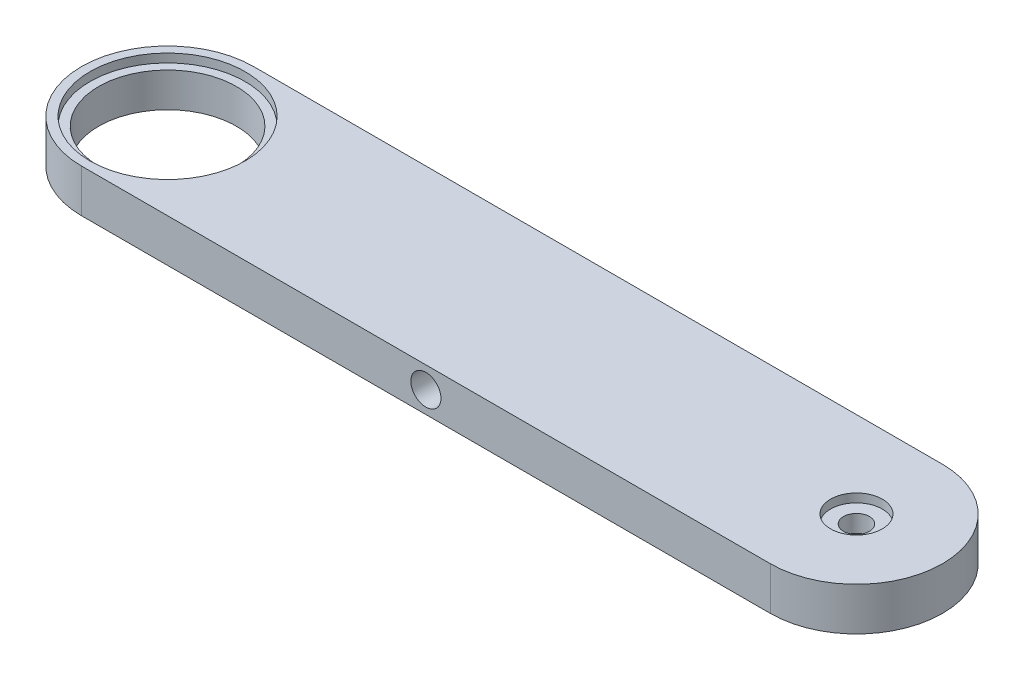
ISO-10303-21;
HEADER;
FILE_DESCRIPTION(('STEP AP214'),'2;1');
FILE_NAME('part.step','',(''),(''),'','','');
FILE_SCHEMA(('AUTOMOTIVE_DESIGN { 1 0 10303 214 1 1 1 1 }'));
ENDSEC;
DATA;
#1=APPLICATION_CONTEXT('core data for automotive mechanical design processes');
#2=APPLICATION_PROTOCOL_DEFINITION('international standard','automotive_design',2000,#1);
#3=PRODUCT_CONTEXT('',#1,'mechanical');
#4=PRODUCT('Part','Part','',(#3));
#5=PRODUCT_RELATED_PRODUCT_CATEGORY('part','',(#4));
#6=PRODUCT_DEFINITION_FORMATION('','',#4);
#7=PRODUCT_DEFINITION_CONTEXT('part definition',#1,'design');
#8=PRODUCT_DEFINITION('design','',#6,#7);
#9=PRODUCT_DEFINITION_SHAPE('','',#8);
#10=(LENGTH_UNIT() NAMED_UNIT(*) SI_UNIT(.MILLI.,.METRE.));
#11=(NAMED_UNIT(*) PLANE_ANGLE_UNIT() SI_UNIT($,.RADIAN.));
#12=(NAMED_UNIT(*) SI_UNIT($,.STERADIAN.) SOLID_ANGLE_UNIT());
#13=UNCERTAINTY_MEASURE_WITH_UNIT(LENGTH_MEASURE(1.E-05),#10,'distance_accuracy_value','');
#14=(GEOMETRIC_REPRESENTATION_CONTEXT(3) GLOBAL_UNCERTAINTY_ASSIGNED_CONTEXT((#13)) GLOBAL_UNIT_ASSIGNED_CONTEXT((#10,
#11,#12)) REPRESENTATION_CONTEXT('',''));
#15=CARTESIAN_POINT('',(0.,0.,0.));
#16=DIRECTION('',(0.,0.,1.));
#17=DIRECTION('',(1.,0.,0.));
#18=AXIS2_PLACEMENT_3D('',#15,#16,#17);
#19=CARTESIAN_POINT('',(40.,0.,0.));
#20=DIRECTION('',(0.,1.,0.));
#21=DIRECTION('',(0.,0.,1.));
#22=AXIS2_PLACEMENT_3D('',#19,#20,#21);
#23=CYLINDRICAL_SURFACE('',#22,1.5);
#24=CARTESIAN_POINT('',(40.,4.,0.));
#25=DIRECTION('',(0.,1.,0.));
#26=DIRECTION('',(0.,0.,1.));
#27=AXIS2_PLACEMENT_3D('',#24,#25,#26);
#28=CIRCLE('',#27,1.5);
#29=CARTESIAN_POINT('',(40.,4.,1.5));
#30=VERTEX_POINT('',#29);
#31=EDGE_CURVE('E149',#30,#30,#28,.T.);
#32=ORIENTED_EDGE('',*,*,#31,.T.);
#33=EDGE_LOOP('',(#32));
#34=FACE_BOUND('',#33,.T.);
#35=CARTESIAN_POINT('',(40.,2.,0.));
#36=DIRECTION('',(0.,-1.,0.));
#37=DIRECTION('',(0.,0.,-1.));
#38=AXIS2_PLACEMENT_3D('',#35,#36,#37);
#39=CIRCLE('',#38,1.5);
#40=CARTESIAN_POINT('',(40.,2.,-1.50000000000001));
#41=VERTEX_POINT('',#40);
#42=EDGE_CURVE('E42',#41,#41,#39,.F.);
#43=ORIENTED_EDGE('',*,*,#42,.F.);
#44=EDGE_LOOP('',(#43));
#45=FACE_BOUND('',#44,.T.);
#46=ADVANCED_FACE('F38',(#34,#45),#23,.F.);
#47=CARTESIAN_POINT('',(-40.,0.,0.));
#48=DIRECTION('',(0.,1.,0.));
#49=DIRECTION('',(0.,0.,1.));
#50=AXIS2_PLACEMENT_3D('',#47,#48,#49);
#51=CYLINDRICAL_SURFACE('',#50,8.);
#52=CARTESIAN_POINT('',(-40.,0.,0.));
#53=DIRECTION('',(0.,1.,0.));
#54=DIRECTION('',(0.,0.,1.));
#55=AXIS2_PLACEMENT_3D('',#52,#53,#54);
#56=CIRCLE('',#55,8.);
#57=CARTESIAN_POINT('',(-40.,0.,8.));
#58=VERTEX_POINT('',#57);
#59=EDGE_CURVE('E114',#58,#58,#56,.T.);
#60=ORIENTED_EDGE('',*,*,#59,.F.);
#61=EDGE_LOOP('',(#60));
#62=FACE_BOUND('',#61,.T.);
#63=CARTESIAN_POINT('',(-40.,4.,0.));
#64=DIRECTION('',(0.,1.,0.));
#65=DIRECTION('',(0.,0.,1.));
#66=AXIS2_PLACEMENT_3D('',#63,#64,#65);
#67=CIRCLE('',#66,8.);
#68=CARTESIAN_POINT('',(-40.,4.,8.));
#69=VERTEX_POINT('',#68);
#70=EDGE_CURVE('E124',#69,#69,#67,.F.);
#71=ORIENTED_EDGE('',*,*,#70,.F.);
#72=EDGE_LOOP('',(#71));
#73=FACE_BOUND('',#72,.T.);
#74=ADVANCED_FACE('F197',(#62,#73),#51,.F.);
#75=CARTESIAN_POINT('',(40.,5.,0.));
#76=DIRECTION('',(0.,-1.,0.));
#77=DIRECTION('',(0.,0.,-1.));
#78=AXIS2_PLACEMENT_3D('',#75,#76,#77);
#79=CYLINDRICAL_SURFACE('',#78,10.);
#80=CARTESIAN_POINT('',(40.,0.,0.));
#81=DIRECTION('',(0.,1.,0.));
#82=DIRECTION('',(0.,0.,1.));
#83=AXIS2_PLACEMENT_3D('',#80,#81,#82);
#84=CIRCLE('',#83,10.);
#85=CARTESIAN_POINT('',(40.,0.,10.));
#86=VERTEX_POINT('',#85);
#87=CARTESIAN_POINT('',(40.,0.,-10.));
#88=VERTEX_POINT('',#87);
#89=EDGE_CURVE('E110',#86,#88,#84,.T.);
#90=ORIENTED_EDGE('',*,*,#89,.T.);
#91=DIRECTION('',(0.,-1.,0.));
#92=VECTOR('',#91,1.);
#93=CARTESIAN_POINT('',(40.,5.,-10.));
#94=LINE('',#93,#92);
#95=CARTESIAN_POINT('',(40.,5.,-10.));
#96=VERTEX_POINT('',#95);
#97=EDGE_CURVE('E11',#96,#88,#94,.T.);
#98=ORIENTED_EDGE('',*,*,#97,.F.);
#99=CARTESIAN_POINT('',(40.,5.,0.));
#100=DIRECTION('',(0.,1.,0.));
#101=DIRECTION('',(0.,0.,1.));
#102=AXIS2_PLACEMENT_3D('',#99,#100,#101);
#103=CIRCLE('',#102,10.);
#104=CARTESIAN_POINT('',(40.,5.,10.));
#105=VERTEX_POINT('',#104);
#106=EDGE_CURVE('E93',#105,#96,#103,.T.);
#107=ORIENTED_EDGE('',*,*,#106,.F.);
#108=DIRECTION('',(0.,-1.,0.));
#109=VECTOR('',#108,1.);
#110=CARTESIAN_POINT('',(40.,5.,10.));
#111=LINE('',#110,#109);
#112=EDGE_CURVE('E106',#105,#86,#111,.T.);
#113=ORIENTED_EDGE('',*,*,#112,.T.);
#114=EDGE_LOOP('',(#90,#98,#107,#113));
#115=FACE_BOUND('',#114,.T.);
#116=ADVANCED_FACE('F40',(#115),#79,.T.);
#117=CARTESIAN_POINT('',(-40.,5.,-10.));
#118=DIRECTION('',(0.,0.,1.));
#119=DIRECTION('',(1.,0.,0.));
#120=AXIS2_PLACEMENT_3D('',#117,#118,#119);
#121=PLANE('',#120);
#122=DIRECTION('',(-1.,0.,0.));
#123=VECTOR('',#122,1.);
#124=CARTESIAN_POINT('',(-40.,0.,-10.));
#125=LINE('',#124,#123);
#126=CARTESIAN_POINT('',(-40.,0.,-10.));
#127=VERTEX_POINT('',#126);
#128=EDGE_CURVE('E98',#88,#127,#125,.T.);
#129=ORIENTED_EDGE('',*,*,#128,.T.);
#130=DIRECTION('',(0.,-1.,0.));
#131=VECTOR('',#130,1.);
#132=CARTESIAN_POINT('',(-40.,5.,-10.));
#133=LINE('',#132,#131);
#134=CARTESIAN_POINT('',(-40.,5.,-10.));
#135=VERTEX_POINT('',#134);
#136=EDGE_CURVE('E49',#135,#127,#133,.T.);
#137=ORIENTED_EDGE('',*,*,#136,.F.);
#138=DIRECTION('',(-1.,0.,0.));
#139=VECTOR('',#138,1.);
#140=CARTESIAN_POINT('',(-40.,5.,-10.));
#141=LINE('',#140,#139);
#142=EDGE_CURVE('E88',#96,#135,#141,.T.);
#143=ORIENTED_EDGE('',*,*,#142,.F.);
#144=ORIENTED_EDGE('',*,*,#97,.T.);
#145=EDGE_LOOP('',(#129,#137,#143,#144));
#146=FACE_BOUND('',#145,.T.);
#147=ADVANCED_FACE('F97',(#146),#121,.F.);
#148=CARTESIAN_POINT('',(-40.,5.,0.));
#149=DIRECTION('',(0.,-1.,0.));
#150=DIRECTION('',(0.,0.,-1.));
#151=AXIS2_PLACEMENT_3D('',#148,#149,#150);
#152=CYLINDRICAL_SURFACE('',#151,10.);
#153=CARTESIAN_POINT('',(-40.,0.,0.));
#154=DIRECTION('',(0.,1.,0.));
#155=DIRECTION('',(0.,0.,1.));
#156=AXIS2_PLACEMENT_3D('',#153,#154,#155);
#157=CIRCLE('',#156,10.);
#158=CARTESIAN_POINT('',(-40.,0.,10.));
#159=VERTEX_POINT('',#158);
#160=EDGE_CURVE('E75',#127,#159,#157,.T.);
#161=ORIENTED_EDGE('',*,*,#160,.T.);
#162=DIRECTION('',(0.,-1.,0.));
#163=VECTOR('',#162,1.);
#164=CARTESIAN_POINT('',(-40.,5.,10.));
#165=LINE('',#164,#163);
#166=CARTESIAN_POINT('',(-40.,5.,10.));
#167=VERTEX_POINT('',#166);
#168=EDGE_CURVE('E100',#167,#159,#165,.T.);
#169=ORIENTED_EDGE('',*,*,#168,.F.);
#170=CARTESIAN_POINT('',(-40.,5.,0.));
#171=DIRECTION('',(0.,1.,0.));
#172=DIRECTION('',(0.,0.,1.));
#173=AXIS2_PLACEMENT_3D('',#170,#171,#172);
#174=CIRCLE('',#173,10.);
#175=EDGE_CURVE('E91',#135,#167,#174,.T.);
#176=ORIENTED_EDGE('',*,*,#175,.F.);
#177=ORIENTED_EDGE('',*,*,#136,.T.);
#178=EDGE_LOOP('',(#161,#169,#176,#177));
#179=FACE_BOUND('',#178,.T.);
#180=ADVANCED_FACE('F102',(#179),#152,.T.);
#181=CARTESIAN_POINT('',(-40.,5.,10.));
#182=DIRECTION('',(0.,0.,-1.));
#183=DIRECTION('',(-1.,0.,0.));
#184=AXIS2_PLACEMENT_3D('',#181,#182,#183);
#185=PLANE('',#184);
#186=CARTESIAN_POINT('',(0.,2.5,10.));
#187=DIRECTION('',(0.,0.,1.));
#188=DIRECTION('',(1.,0.,0.));
#189=AXIS2_PLACEMENT_3D('',#186,#187,#188);
#190=CIRCLE('',#189,1.75);
#191=CARTESIAN_POINT('',(1.75,2.5,10.));
#192=VERTEX_POINT('',#191);
#193=EDGE_CURVE('E165',#192,#192,#190,.T.);
#194=ORIENTED_EDGE('',*,*,#193,.F.);
#195=EDGE_LOOP('',(#194));
#196=FACE_BOUND('',#195,.T.);
#197=DIRECTION('',(1.,0.,0.));
#198=VECTOR('',#197,1.);
#199=CARTESIAN_POINT('',(-40.,0.,10.));
#200=LINE('',#199,#198);
#201=EDGE_CURVE('E81',#159,#86,#200,.T.);
#202=ORIENTED_EDGE('',*,*,#201,.T.);
#203=ORIENTED_EDGE('',*,*,#112,.F.);
#204=DIRECTION('',(1.,0.,0.));
#205=VECTOR('',#204,1.);
#206=CARTESIAN_POINT('',(-40.,5.,10.));
#207=LINE('',#206,#205);
#208=EDGE_CURVE('E58',#167,#105,#207,.T.);
#209=ORIENTED_EDGE('',*,*,#208,.F.);
#210=ORIENTED_EDGE('',*,*,#168,.T.);
#211=EDGE_LOOP('',(#202,#203,#209,#210));
#212=FACE_BOUND('',#211,.T.);
#213=ADVANCED_FACE('F182',(#196,#212),#185,.F.);
#214=CARTESIAN_POINT('',(40.,5.,0.));
#215=DIRECTION('',(0.,1.,0.));
#216=DIRECTION('',(0.,0.,1.));
#217=AXIS2_PLACEMENT_3D('',#214,#215,#216);
#218=PLANE('',#217);
#219=CARTESIAN_POINT('',(40.,5.,0.));
#220=DIRECTION('',(0.,1.,0.));
#221=DIRECTION('',(0.,0.,1.));
#222=AXIS2_PLACEMENT_3D('',#219,#220,#221);
#223=CIRCLE('',#222,3.);
#224=CARTESIAN_POINT('',(40.,5.,3.));
#225=VERTEX_POINT('',#224);
#226=EDGE_CURVE('E144',#225,#225,#223,.T.);
#227=ORIENTED_EDGE('',*,*,#226,.F.);
#228=EDGE_LOOP('',(#227));
#229=FACE_BOUND('',#228,.T.);
#230=CARTESIAN_POINT('',(-40.,5.,0.));
#231=DIRECTION('',(0.,1.,0.));
#232=DIRECTION('',(0.,0.,1.));
#233=AXIS2_PLACEMENT_3D('',#230,#231,#232);
#234=CIRCLE('',#233,9.);
#235=CARTESIAN_POINT('',(-40.,5.,8.99999999999999));
#236=VERTEX_POINT('',#235);
#237=EDGE_CURVE('E135',#236,#236,#234,.T.);
#238=ORIENTED_EDGE('',*,*,#237,.F.);
#239=EDGE_LOOP('',(#238));
#240=FACE_BOUND('',#239,.T.);
#241=ORIENTED_EDGE('',*,*,#106,.T.);
#242=ORIENTED_EDGE('',*,*,#142,.T.);
#243=ORIENTED_EDGE('',*,*,#175,.T.);
#244=ORIENTED_EDGE('',*,*,#208,.T.);
#245=EDGE_LOOP('',(#241,#242,#243,#244));
#246=FACE_BOUND('',#245,.T.);
#247=ADVANCED_FACE('F89',(#229,#240,#246),#218,.T.);
#248=CARTESIAN_POINT('',(40.,0.,0.));
#249=DIRECTION('',(0.,1.,0.));
#250=DIRECTION('',(0.,0.,1.));
#251=AXIS2_PLACEMENT_3D('',#248,#249,#250);
#252=PLANE('',#251);
#253=CARTESIAN_POINT('',(40.,0.,0.));
#254=DIRECTION('',(0.,-1.,0.));
#255=DIRECTION('',(0.,0.,-1.));
#256=AXIS2_PLACEMENT_3D('',#253,#254,#255);
#257=CIRCLE('',#256,4.00000000000001);
#258=CARTESIAN_POINT('',(40.,0.,-4.00000000000001));
#259=VERTEX_POINT('',#258);
#260=EDGE_CURVE('E156',#259,#259,#257,.T.);
#261=ORIENTED_EDGE('',*,*,#260,.F.);
#262=EDGE_LOOP('',(#261));
#263=FACE_BOUND('',#262,.T.);
#264=ORIENTED_EDGE('',*,*,#59,.T.);
#265=EDGE_LOOP('',(#264));
#266=FACE_BOUND('',#265,.T.);
#267=ORIENTED_EDGE('',*,*,#89,.F.);
#268=ORIENTED_EDGE('',*,*,#201,.F.);
#269=ORIENTED_EDGE('',*,*,#160,.F.);
#270=ORIENTED_EDGE('',*,*,#128,.F.);
#271=EDGE_LOOP('',(#267,#268,#269,#270));
#272=FACE_BOUND('',#271,.T.);
#273=ADVANCED_FACE('F190',(#263,#266,#272),#252,.F.);
#274=CARTESIAN_POINT('',(-40.,4.,0.));
#275=DIRECTION('',(0.,1.,0.));
#276=DIRECTION('',(0.,0.,1.));
#277=AXIS2_PLACEMENT_3D('',#274,#275,#276);
#278=PLANE('',#277);
#279=CARTESIAN_POINT('',(-40.,4.,0.));
#280=DIRECTION('',(0.,1.,0.));
#281=DIRECTION('',(0.,0.,1.));
#282=AXIS2_PLACEMENT_3D('',#279,#280,#281);
#283=CIRCLE('',#282,9.);
#284=CARTESIAN_POINT('',(-40.,4.,8.99999999999999));
#285=VERTEX_POINT('',#284);
#286=EDGE_CURVE('E127',#285,#285,#283,.T.);
#287=ORIENTED_EDGE('',*,*,#286,.T.);
#288=EDGE_LOOP('',(#287));
#289=FACE_BOUND('',#288,.T.);
#290=ORIENTED_EDGE('',*,*,#70,.T.);
#291=EDGE_LOOP('',(#290));
#292=FACE_BOUND('',#291,.T.);
#293=ADVANCED_FACE('F220',(#289,#292),#278,.T.);
#294=CARTESIAN_POINT('',(-40.,4.,0.));
#295=DIRECTION('',(0.,1.,0.));
#296=DIRECTION('',(0.,0.,1.));
#297=AXIS2_PLACEMENT_3D('',#294,#295,#296);
#298=CYLINDRICAL_SURFACE('',#297,9.);
#299=ORIENTED_EDGE('',*,*,#286,.F.);
#300=EDGE_LOOP('',(#299));
#301=FACE_BOUND('',#300,.T.);
#302=ORIENTED_EDGE('',*,*,#237,.T.);
#303=EDGE_LOOP('',(#302));
#304=FACE_BOUND('',#303,.T.);
#305=ADVANCED_FACE('F218',(#301,#304),#298,.F.);
#306=CARTESIAN_POINT('',(40.,4.,0.));
#307=DIRECTION('',(0.,1.,0.));
#308=DIRECTION('',(0.,0.,1.));
#309=AXIS2_PLACEMENT_3D('',#306,#307,#308);
#310=CYLINDRICAL_SURFACE('',#309,3.);
#311=CARTESIAN_POINT('',(40.,4.,0.));
#312=DIRECTION('',(0.,1.,0.));
#313=DIRECTION('',(0.,0.,1.));
#314=AXIS2_PLACEMENT_3D('',#311,#312,#313);
#315=CIRCLE('',#314,3.);
#316=CARTESIAN_POINT('',(40.,4.,3.));
#317=VERTEX_POINT('',#316);
#318=EDGE_CURVE('E141',#317,#317,#315,.T.);
#319=ORIENTED_EDGE('',*,*,#318,.F.);
#320=EDGE_LOOP('',(#319));
#321=FACE_BOUND('',#320,.T.);
#322=ORIENTED_EDGE('',*,*,#226,.T.);
#323=EDGE_LOOP('',(#322));
#324=FACE_BOUND('',#323,.T.);
#325=ADVANCED_FACE('F215',(#321,#324),#310,.F.);
#326=CARTESIAN_POINT('',(0.,4.,0.));
#327=DIRECTION('',(0.,1.,0.));
#328=DIRECTION('',(0.,0.,1.));
#329=AXIS2_PLACEMENT_3D('',#326,#327,#328);
#330=PLANE('',#329);
#331=ORIENTED_EDGE('',*,*,#31,.F.);
#332=EDGE_LOOP('',(#331));
#333=FACE_BOUND('',#332,.T.);
#334=ORIENTED_EDGE('',*,*,#318,.T.);
#335=EDGE_LOOP('',(#334));
#336=FACE_BOUND('',#335,.T.);
#337=ADVANCED_FACE('F211',(#333,#336),#330,.T.);
#338=CARTESIAN_POINT('',(40.,2.,0.));
#339=DIRECTION('',(0.,-1.,0.));
#340=DIRECTION('',(0.,0.,-1.));
#341=AXIS2_PLACEMENT_3D('',#338,#339,#340);
#342=PLANE('',#341);
#343=CARTESIAN_POINT('',(40.,2.,0.));
#344=DIRECTION('',(0.,-1.,0.));
#345=DIRECTION('',(0.,0.,-1.));
#346=AXIS2_PLACEMENT_3D('',#343,#344,#345);
#347=CIRCLE('',#346,4.00000000000001);
#348=CARTESIAN_POINT('',(40.,2.,-4.00000000000001));
#349=VERTEX_POINT('',#348);
#350=EDGE_CURVE('E160',#349,#349,#347,.T.);
#351=ORIENTED_EDGE('',*,*,#350,.T.);
#352=EDGE_LOOP('',(#351));
#353=FACE_BOUND('',#352,.T.);
#354=ORIENTED_EDGE('',*,*,#42,.T.);
#355=EDGE_LOOP('',(#354));
#356=FACE_BOUND('',#355,.T.);
#357=ADVANCED_FACE('F214',(#353,#356),#342,.T.);
#358=CARTESIAN_POINT('',(40.,2.,0.));
#359=DIRECTION('',(0.,-1.,0.));
#360=DIRECTION('',(0.,0.,-1.));
#361=AXIS2_PLACEMENT_3D('',#358,#359,#360);
#362=CYLINDRICAL_SURFACE('',#361,4.00000000000001);
#363=ORIENTED_EDGE('',*,*,#350,.F.);
#364=EDGE_LOOP('',(#363));
#365=FACE_BOUND('',#364,.T.);
#366=ORIENTED_EDGE('',*,*,#260,.T.);
#367=EDGE_LOOP('',(#366));
#368=FACE_BOUND('',#367,.T.);
#369=ADVANCED_FACE('F178',(#365,#368),#362,.F.);
#370=CARTESIAN_POINT('',(0.,2.5,0.));
#371=DIRECTION('',(0.,0.,1.));
#372=DIRECTION('',(1.,0.,0.));
#373=AXIS2_PLACEMENT_3D('',#370,#371,#372);
#374=CYLINDRICAL_SURFACE('',#373,1.75);
#375=CARTESIAN_POINT('',(0.,2.5,0.));
#376=DIRECTION('',(0.,0.,1.));
#377=DIRECTION('',(1.,0.,0.));
#378=AXIS2_PLACEMENT_3D('',#375,#376,#377);
#379=CIRCLE('',#378,1.75);
#380=CARTESIAN_POINT('',(1.75,2.5,0.));
#381=VERTEX_POINT('',#380);
#382=EDGE_CURVE('E161',#381,#381,#379,.T.);
#383=ORIENTED_EDGE('',*,*,#382,.F.);
#384=EDGE_LOOP('',(#383));
#385=FACE_BOUND('',#384,.T.);
#386=ORIENTED_EDGE('',*,*,#193,.T.);
#387=EDGE_LOOP('',(#386));
#388=FACE_BOUND('',#387,.T.);
#389=ADVANCED_FACE('F175',(#385,#388),#374,.F.);
#390=CARTESIAN_POINT('',(0.,2.5,0.));
#391=DIRECTION('',(0.,0.,1.));
#392=DIRECTION('',(1.,0.,0.));
#393=AXIS2_PLACEMENT_3D('',#390,#391,#392);
#394=PLANE('',#393);
#395=ORIENTED_EDGE('',*,*,#382,.T.);
#396=EDGE_LOOP('',(#395));
#397=FACE_BOUND('',#396,.T.);
#398=ADVANCED_FACE('F173',(#397),#394,.T.);
#399=CLOSED_SHELL('',(#46,#74,#116,#147,#180,#213,#247,#273,#293,#305,#325,#337,#357,#369,#389,#398));
#400=MANIFOLD_SOLID_BREP('B2',#399);
#401=ADVANCED_BREP_SHAPE_REPRESENTATION('',(#18,#400),#14);
#402=SHAPE_DEFINITION_REPRESENTATION(#9,#401);
ENDSEC;
END-ISO-10303-21;
